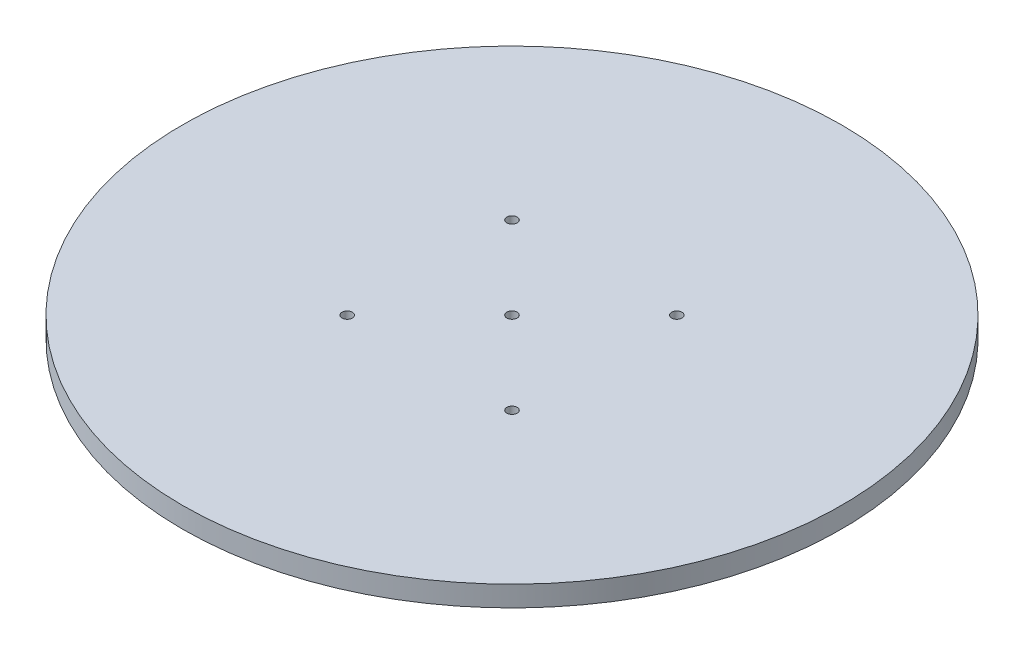
ISO-10303-21;
HEADER;
FILE_DESCRIPTION(('STEP AP214'),'2;1');
FILE_NAME('part.step','',(''),(''),'','','');
FILE_SCHEMA(('AUTOMOTIVE_DESIGN { 1 0 10303 214 1 1 1 1 }'));
ENDSEC;
DATA;
#1=APPLICATION_CONTEXT('core data for automotive mechanical design processes');
#2=APPLICATION_PROTOCOL_DEFINITION('international standard','automotive_design',2000,#1);
#3=PRODUCT_CONTEXT('',#1,'mechanical');
#4=PRODUCT('Part','Part','',(#3));
#5=PRODUCT_RELATED_PRODUCT_CATEGORY('part','',(#4));
#6=PRODUCT_DEFINITION_FORMATION('','',#4);
#7=PRODUCT_DEFINITION_CONTEXT('part definition',#1,'design');
#8=PRODUCT_DEFINITION('design','',#6,#7);
#9=PRODUCT_DEFINITION_SHAPE('','',#8);
#10=(LENGTH_UNIT() NAMED_UNIT(*) SI_UNIT(.MILLI.,.METRE.));
#11=(NAMED_UNIT(*) PLANE_ANGLE_UNIT() SI_UNIT($,.RADIAN.));
#12=(NAMED_UNIT(*) SI_UNIT($,.STERADIAN.) SOLID_ANGLE_UNIT());
#13=UNCERTAINTY_MEASURE_WITH_UNIT(LENGTH_MEASURE(1.E-05),#10,'distance_accuracy_value','');
#14=(GEOMETRIC_REPRESENTATION_CONTEXT(3) GLOBAL_UNCERTAINTY_ASSIGNED_CONTEXT((#13)) GLOBAL_UNIT_ASSIGNED_CONTEXT((#10,
#11,#12)) REPRESENTATION_CONTEXT('',''));
#15=CARTESIAN_POINT('',(0.,0.,0.));
#16=DIRECTION('',(0.,0.,1.));
#17=DIRECTION('',(1.,0.,0.));
#18=AXIS2_PLACEMENT_3D('',#15,#16,#17);
#19=CARTESIAN_POINT('',(0.,7.9375,0.));
#20=DIRECTION('',(0.,-1.,0.));
#21=DIRECTION('',(0.,0.,-1.));
#22=AXIS2_PLACEMENT_3D('',#19,#20,#21);
#23=CYLINDRICAL_SURFACE('',#22,127.);
#24=CARTESIAN_POINT('',(0.,7.9375,0.));
#25=DIRECTION('',(0.,1.,0.));
#26=DIRECTION('',(0.,0.,1.));
#27=AXIS2_PLACEMENT_3D('',#24,#25,#26);
#28=CIRCLE('',#27,127.);
#29=CARTESIAN_POINT('',(0.,7.9375,127.));
#30=VERTEX_POINT('',#29);
#31=EDGE_CURVE('E10',#30,#30,#28,.T.);
#32=ORIENTED_EDGE('',*,*,#31,.F.);
#33=EDGE_LOOP('',(#32));
#34=FACE_BOUND('',#33,.T.);
#35=CARTESIAN_POINT('',(0.,0.,0.));
#36=DIRECTION('',(0.,1.,0.));
#37=DIRECTION('',(0.,0.,1.));
#38=AXIS2_PLACEMENT_3D('',#35,#36,#37);
#39=CIRCLE('',#38,127.);
#40=CARTESIAN_POINT('',(0.,0.,127.));
#41=VERTEX_POINT('',#40);
#42=EDGE_CURVE('E34',#41,#41,#39,.T.);
#43=ORIENTED_EDGE('',*,*,#42,.T.);
#44=EDGE_LOOP('',(#43));
#45=FACE_BOUND('',#44,.T.);
#46=ADVANCED_FACE('F31',(#34,#45),#23,.T.);
#47=CARTESIAN_POINT('',(0.,7.9375,0.));
#48=DIRECTION('',(0.,1.,0.));
#49=DIRECTION('',(0.,0.,1.));
#50=AXIS2_PLACEMENT_3D('',#47,#48,#49);
#51=PLANE('',#50);
#52=CARTESIAN_POINT('',(31.75,7.9375,-31.75));
#53=DIRECTION('',(0.,1.,0.));
#54=DIRECTION('',(0.,0.,1.));
#55=AXIS2_PLACEMENT_3D('',#52,#53,#54);
#56=CIRCLE('',#55,1.98437499999999);
#57=CARTESIAN_POINT('',(31.75,7.9375,-29.765625));
#58=VERTEX_POINT('',#57);
#59=EDGE_CURVE('E69',#58,#58,#56,.T.);
#60=ORIENTED_EDGE('',*,*,#59,.F.);
#61=EDGE_LOOP('',(#60));
#62=FACE_BOUND('',#61,.T.);
#63=CARTESIAN_POINT('',(-31.75,7.9375,31.75));
#64=DIRECTION('',(0.,1.,0.));
#65=DIRECTION('',(0.,0.,1.));
#66=AXIS2_PLACEMENT_3D('',#63,#64,#65);
#67=CIRCLE('',#66,1.98437499999999);
#68=CARTESIAN_POINT('',(-31.75,7.9375,33.734375));
#69=VERTEX_POINT('',#68);
#70=EDGE_CURVE('E63',#69,#69,#67,.T.);
#71=ORIENTED_EDGE('',*,*,#70,.F.);
#72=EDGE_LOOP('',(#71));
#73=FACE_BOUND('',#72,.T.);
#74=CARTESIAN_POINT('',(-31.75,7.9375,-31.75));
#75=DIRECTION('',(0.,1.,0.));
#76=DIRECTION('',(0.,0.,1.));
#77=AXIS2_PLACEMENT_3D('',#74,#75,#76);
#78=CIRCLE('',#77,1.98437499999999);
#79=CARTESIAN_POINT('',(-31.75,7.9375,-29.765625));
#80=VERTEX_POINT('',#79);
#81=EDGE_CURVE('E57',#80,#80,#78,.T.);
#82=ORIENTED_EDGE('',*,*,#81,.F.);
#83=EDGE_LOOP('',(#82));
#84=FACE_BOUND('',#83,.T.);
#85=CARTESIAN_POINT('',(31.75,7.9375,31.75));
#86=DIRECTION('',(0.,1.,0.));
#87=DIRECTION('',(0.,0.,1.));
#88=AXIS2_PLACEMENT_3D('',#85,#86,#87);
#89=CIRCLE('',#88,1.98437499999999);
#90=CARTESIAN_POINT('',(31.75,7.9375,33.734375));
#91=VERTEX_POINT('',#90);
#92=EDGE_CURVE('E51',#91,#91,#89,.T.);
#93=ORIENTED_EDGE('',*,*,#92,.F.);
#94=EDGE_LOOP('',(#93));
#95=FACE_BOUND('',#94,.T.);
#96=CARTESIAN_POINT('',(0.,7.9375,0.));
#97=DIRECTION('',(0.,1.,0.));
#98=DIRECTION('',(0.,0.,1.));
#99=AXIS2_PLACEMENT_3D('',#96,#97,#98);
#100=CIRCLE('',#99,1.98437499999999);
#101=CARTESIAN_POINT('',(0.,7.9375,1.98437499999999));
#102=VERTEX_POINT('',#101);
#103=EDGE_CURVE('E45',#102,#102,#100,.T.);
#104=ORIENTED_EDGE('',*,*,#103,.F.);
#105=EDGE_LOOP('',(#104));
#106=FACE_BOUND('',#105,.T.);
#107=ORIENTED_EDGE('',*,*,#31,.T.);
#108=EDGE_LOOP('',(#107));
#109=FACE_BOUND('',#108,.T.);
#110=ADVANCED_FACE('F75',(#62,#73,#84,#95,#106,#109),#51,.T.);
#111=CARTESIAN_POINT('',(0.,0.,0.));
#112=DIRECTION('',(0.,1.,0.));
#113=DIRECTION('',(0.,0.,1.));
#114=AXIS2_PLACEMENT_3D('',#111,#112,#113);
#115=PLANE('',#114);
#116=CARTESIAN_POINT('',(31.75,0.,-31.75));
#117=DIRECTION('',(0.,1.,0.));
#118=DIRECTION('',(0.,0.,1.));
#119=AXIS2_PLACEMENT_3D('',#116,#117,#118);
#120=CIRCLE('',#119,1.984375);
#121=CARTESIAN_POINT('',(31.75,0.,-29.765625));
#122=VERTEX_POINT('',#121);
#123=EDGE_CURVE('E66',#122,#122,#120,.T.);
#124=ORIENTED_EDGE('',*,*,#123,.T.);
#125=EDGE_LOOP('',(#124));
#126=FACE_BOUND('',#125,.T.);
#127=CARTESIAN_POINT('',(-31.75,0.,31.75));
#128=DIRECTION('',(0.,1.,0.));
#129=DIRECTION('',(0.,0.,1.));
#130=AXIS2_PLACEMENT_3D('',#127,#128,#129);
#131=CIRCLE('',#130,1.984375);
#132=CARTESIAN_POINT('',(-31.75,0.,33.734375));
#133=VERTEX_POINT('',#132);
#134=EDGE_CURVE('E60',#133,#133,#131,.T.);
#135=ORIENTED_EDGE('',*,*,#134,.T.);
#136=EDGE_LOOP('',(#135));
#137=FACE_BOUND('',#136,.T.);
#138=CARTESIAN_POINT('',(-31.75,0.,-31.75));
#139=DIRECTION('',(0.,1.,0.));
#140=DIRECTION('',(0.,0.,1.));
#141=AXIS2_PLACEMENT_3D('',#138,#139,#140);
#142=CIRCLE('',#141,1.984375);
#143=CARTESIAN_POINT('',(-31.75,0.,-29.765625));
#144=VERTEX_POINT('',#143);
#145=EDGE_CURVE('E54',#144,#144,#142,.T.);
#146=ORIENTED_EDGE('',*,*,#145,.T.);
#147=EDGE_LOOP('',(#146));
#148=FACE_BOUND('',#147,.T.);
#149=CARTESIAN_POINT('',(31.75,0.,31.75));
#150=DIRECTION('',(0.,1.,0.));
#151=DIRECTION('',(0.,0.,1.));
#152=AXIS2_PLACEMENT_3D('',#149,#150,#151);
#153=CIRCLE('',#152,1.984375);
#154=CARTESIAN_POINT('',(31.75,0.,33.734375));
#155=VERTEX_POINT('',#154);
#156=EDGE_CURVE('E48',#155,#155,#153,.T.);
#157=ORIENTED_EDGE('',*,*,#156,.T.);
#158=EDGE_LOOP('',(#157));
#159=FACE_BOUND('',#158,.T.);
#160=CARTESIAN_POINT('',(0.,0.,0.));
#161=DIRECTION('',(0.,1.,0.));
#162=DIRECTION('',(0.,0.,1.));
#163=AXIS2_PLACEMENT_3D('',#160,#161,#162);
#164=CIRCLE('',#163,1.984375);
#165=CARTESIAN_POINT('',(0.,0.,1.984375));
#166=VERTEX_POINT('',#165);
#167=EDGE_CURVE('E41',#166,#166,#164,.T.);
#168=ORIENTED_EDGE('',*,*,#167,.T.);
#169=EDGE_LOOP('',(#168));
#170=FACE_BOUND('',#169,.T.);
#171=ORIENTED_EDGE('',*,*,#42,.F.);
#172=EDGE_LOOP('',(#171));
#173=FACE_BOUND('',#172,.T.);
#174=ADVANCED_FACE('F78',(#126,#137,#148,#159,#170,#173),#115,.F.);
#175=CARTESIAN_POINT('',(0.,7.9375,0.));
#176=DIRECTION('',(0.,1.,0.));
#177=DIRECTION('',(0.,0.,1.));
#178=AXIS2_PLACEMENT_3D('',#175,#176,#177);
#179=CYLINDRICAL_SURFACE('',#178,1.98437499999999);
#180=ORIENTED_EDGE('',*,*,#167,.F.);
#181=EDGE_LOOP('',(#180));
#182=FACE_BOUND('',#181,.T.);
#183=ORIENTED_EDGE('',*,*,#103,.T.);
#184=EDGE_LOOP('',(#183));
#185=FACE_BOUND('',#184,.T.);
#186=ADVANCED_FACE('F88',(#182,#185),#179,.F.);
#187=CARTESIAN_POINT('',(31.75,7.9375,31.75));
#188=DIRECTION('',(0.,1.,0.));
#189=DIRECTION('',(0.,0.,1.));
#190=AXIS2_PLACEMENT_3D('',#187,#188,#189);
#191=CYLINDRICAL_SURFACE('',#190,1.98437499999999);
#192=ORIENTED_EDGE('',*,*,#156,.F.);
#193=EDGE_LOOP('',(#192));
#194=FACE_BOUND('',#193,.T.);
#195=ORIENTED_EDGE('',*,*,#92,.T.);
#196=EDGE_LOOP('',(#195));
#197=FACE_BOUND('',#196,.T.);
#198=ADVANCED_FACE('F90',(#194,#197),#191,.F.);
#199=CARTESIAN_POINT('',(-31.75,7.9375,-31.75));
#200=DIRECTION('',(0.,1.,0.));
#201=DIRECTION('',(0.,0.,1.));
#202=AXIS2_PLACEMENT_3D('',#199,#200,#201);
#203=CYLINDRICAL_SURFACE('',#202,1.98437499999999);
#204=ORIENTED_EDGE('',*,*,#145,.F.);
#205=EDGE_LOOP('',(#204));
#206=FACE_BOUND('',#205,.T.);
#207=ORIENTED_EDGE('',*,*,#81,.T.);
#208=EDGE_LOOP('',(#207));
#209=FACE_BOUND('',#208,.T.);
#210=ADVANCED_FACE('F97',(#206,#209),#203,.F.);
#211=CARTESIAN_POINT('',(-31.75,7.9375,31.75));
#212=DIRECTION('',(0.,1.,0.));
#213=DIRECTION('',(0.,0.,1.));
#214=AXIS2_PLACEMENT_3D('',#211,#212,#213);
#215=CYLINDRICAL_SURFACE('',#214,1.98437499999999);
#216=ORIENTED_EDGE('',*,*,#134,.F.);
#217=EDGE_LOOP('',(#216));
#218=FACE_BOUND('',#217,.T.);
#219=ORIENTED_EDGE('',*,*,#70,.T.);
#220=EDGE_LOOP('',(#219));
#221=FACE_BOUND('',#220,.T.);
#222=ADVANCED_FACE('F136',(#218,#221),#215,.F.);
#223=CARTESIAN_POINT('',(31.75,7.9375,-31.75));
#224=DIRECTION('',(0.,1.,0.));
#225=DIRECTION('',(0.,0.,1.));
#226=AXIS2_PLACEMENT_3D('',#223,#224,#225);
#227=CYLINDRICAL_SURFACE('',#226,1.98437499999999);
#228=ORIENTED_EDGE('',*,*,#123,.F.);
#229=EDGE_LOOP('',(#228));
#230=FACE_BOUND('',#229,.T.);
#231=ORIENTED_EDGE('',*,*,#59,.T.);
#232=EDGE_LOOP('',(#231));
#233=FACE_BOUND('',#232,.T.);
#234=ADVANCED_FACE('F73',(#230,#233),#227,.F.);
#235=CLOSED_SHELL('',(#46,#110,#174,#186,#198,#210,#222,#234));
#236=MANIFOLD_SOLID_BREP('B2',#235);
#237=ADVANCED_BREP_SHAPE_REPRESENTATION('',(#18,#236),#14);
#238=SHAPE_DEFINITION_REPRESENTATION(#9,#237);
ENDSEC;
END-ISO-10303-21;
